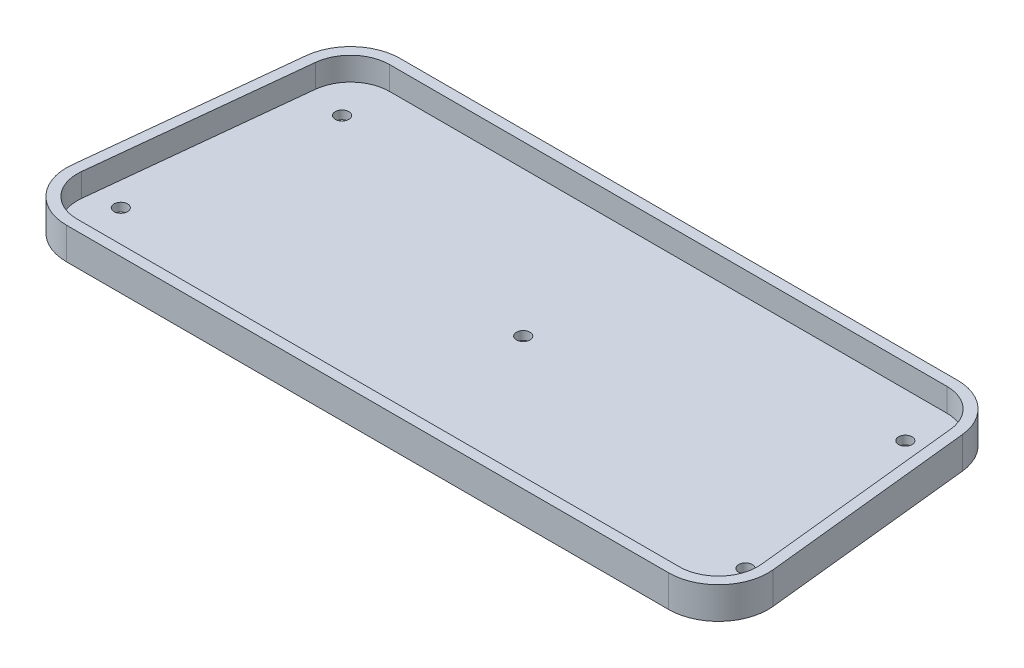
ISO-10303-21;
HEADER;
FILE_DESCRIPTION(('STEP AP214'),'2;1');
FILE_NAME('part.step','',(''),(''),'','','');
FILE_SCHEMA(('AUTOMOTIVE_DESIGN { 1 0 10303 214 1 1 1 1 }'));
ENDSEC;
DATA;
#1=APPLICATION_CONTEXT('core data for automotive mechanical design processes');
#2=APPLICATION_PROTOCOL_DEFINITION('international standard','automotive_design',2000,#1);
#3=PRODUCT_CONTEXT('',#1,'mechanical');
#4=PRODUCT('Part','Part','',(#3));
#5=PRODUCT_RELATED_PRODUCT_CATEGORY('part','',(#4));
#6=PRODUCT_DEFINITION_FORMATION('','',#4);
#7=PRODUCT_DEFINITION_CONTEXT('part definition',#1,'design');
#8=PRODUCT_DEFINITION('design','',#6,#7);
#9=PRODUCT_DEFINITION_SHAPE('','',#8);
#10=(LENGTH_UNIT() NAMED_UNIT(*) SI_UNIT(.MILLI.,.METRE.));
#11=(NAMED_UNIT(*) PLANE_ANGLE_UNIT() SI_UNIT($,.RADIAN.));
#12=(NAMED_UNIT(*) SI_UNIT($,.STERADIAN.) SOLID_ANGLE_UNIT());
#13=UNCERTAINTY_MEASURE_WITH_UNIT(LENGTH_MEASURE(1.E-05),#10,'distance_accuracy_value','');
#14=(GEOMETRIC_REPRESENTATION_CONTEXT(3) GLOBAL_UNCERTAINTY_ASSIGNED_CONTEXT((#13)) GLOBAL_UNIT_ASSIGNED_CONTEXT((#10,
#11,#12)) REPRESENTATION_CONTEXT('',''));
#15=CARTESIAN_POINT('',(0.,0.,0.));
#16=DIRECTION('',(0.,0.,1.));
#17=DIRECTION('',(1.,0.,0.));
#18=AXIS2_PLACEMENT_3D('',#15,#16,#17);
#19=CARTESIAN_POINT('',(-96.2493292957829,2.54,2.46915133417901));
#20=DIRECTION('',(0.,1.,0.));
#21=DIRECTION('',(0.,0.,1.));
#22=AXIS2_PLACEMENT_3D('',#19,#20,#21);
#23=PLANE('',#22);
#24=CARTESIAN_POINT('',(-99.6190894182931,2.54,-2.26032866582099));
#25=DIRECTION('',(0.,1.,0.));
#26=DIRECTION('',(0.,0.,1.));
#27=AXIS2_PLACEMENT_3D('',#24,#25,#26);
#28=CIRCLE('',#27,2.03200000000001);
#29=CARTESIAN_POINT('',(-99.6190894182931,2.54,-0.228328665820987));
#30=VERTEX_POINT('',#29);
#31=EDGE_CURVE('E284',#30,#30,#28,.T.);
#32=ORIENTED_EDGE('',*,*,#31,.F.);
#33=EDGE_LOOP('',(#32));
#34=FACE_BOUND('',#33,.T.);
#35=CARTESIAN_POINT('',(87.7313105817069,2.54,-2.26032866582102));
#36=DIRECTION('',(0.,1.,0.));
#37=DIRECTION('',(0.,0.,1.));
#38=AXIS2_PLACEMENT_3D('',#35,#36,#37);
#39=CIRCLE('',#38,2.03200000000001);
#40=CARTESIAN_POINT('',(87.7313105817069,2.54,-0.228328665821011));
#41=VERTEX_POINT('',#40);
#42=EDGE_CURVE('E299',#41,#41,#39,.T.);
#43=ORIENTED_EDGE('',*,*,#42,.F.);
#44=EDGE_LOOP('',(#43));
#45=FACE_BOUND('',#44,.T.);
#46=CARTESIAN_POINT('',(-96.2493292957829,2.54,2.46915133417901));
#47=DIRECTION('',(0.,1.,0.));
#48=DIRECTION('',(0.,0.,1.));
#49=AXIS2_PLACEMENT_3D('',#46,#47,#48);
#50=CIRCLE('',#49,11.7475);
#51=CARTESIAN_POINT('',(-107.931308609526,2.54,1.23015352817597));
#52=VERTEX_POINT('',#51);
#53=CARTESIAN_POINT('',(-96.2493292957829,2.54,14.216651334179));
#54=VERTEX_POINT('',#53);
#55=EDGE_CURVE('E308',#52,#54,#50,.T.);
#56=ORIENTED_EDGE('',*,*,#55,.T.);
#57=DIRECTION('',(1.,0.,0.));
#58=VECTOR('',#57,1.);
#59=CARTESIAN_POINT('',(-96.2493292957829,2.54,14.216651334179));
#60=LINE('',#59,#58);
#61=CARTESIAN_POINT('',(84.3615504591966,2.54,14.216651334179));
#62=VERTEX_POINT('',#61);
#63=EDGE_CURVE('E71',#54,#62,#60,.T.);
#64=ORIENTED_EDGE('',*,*,#63,.T.);
#65=CARTESIAN_POINT('',(84.3615504591966,2.54,2.46915133417898));
#66=DIRECTION('',(0.,1.,0.));
#67=DIRECTION('',(0.,0.,1.));
#68=AXIS2_PLACEMENT_3D('',#65,#66,#67);
#69=CIRCLE('',#68,11.7475);
#70=CARTESIAN_POINT('',(96.0435297729397,2.54,1.23015352817594));
#71=VERTEX_POINT('',#70);
#72=EDGE_CURVE('E313',#62,#71,#69,.T.);
#73=ORIENTED_EDGE('',*,*,#72,.T.);
#74=DIRECTION('',(-0.105469062013453,0.,-0.994422584698277));
#75=VECTOR('',#74,1.);
#76=CARTESIAN_POINT('',(96.0435297729397,2.54,1.23015352817595));
#77=LINE('',#76,#75);
#78=CARTESIAN_POINT('',(89.3086812880912,2.54,-62.2698464718241));
#79=VERTEX_POINT('',#78);
#80=EDGE_CURVE('E320',#71,#79,#77,.T.);
#81=ORIENTED_EDGE('',*,*,#80,.T.);
#82=CARTESIAN_POINT('',(77.6267019743482,2.54,-61.030848665821));
#83=DIRECTION('',(0.,1.,0.));
#84=DIRECTION('',(0.,0.,1.));
#85=AXIS2_PLACEMENT_3D('',#82,#83,#84);
#86=CIRCLE('',#85,11.7475);
#87=CARTESIAN_POINT('',(77.6267019743482,2.54,-72.778348665821));
#88=VERTEX_POINT('',#87);
#89=EDGE_CURVE('E318',#79,#88,#86,.T.);
#90=ORIENTED_EDGE('',*,*,#89,.T.);
#91=DIRECTION('',(-1.,0.,0.));
#92=VECTOR('',#91,1.);
#93=CARTESIAN_POINT('',(77.6267019743482,2.54,-72.778348665821));
#94=LINE('',#93,#92);
#95=CARTESIAN_POINT('',(-89.5144808109344,2.54,-72.778348665821));
#96=VERTEX_POINT('',#95);
#97=EDGE_CURVE('E324',#88,#96,#94,.T.);
#98=ORIENTED_EDGE('',*,*,#97,.T.);
#99=CARTESIAN_POINT('',(-89.5144808109345,2.54,-61.030848665821));
#100=DIRECTION('',(0.,1.,0.));
#101=DIRECTION('',(0.,0.,1.));
#102=AXIS2_PLACEMENT_3D('',#99,#100,#101);
#103=CIRCLE('',#102,11.7475);
#104=CARTESIAN_POINT('',(-101.196460124677,2.54,-62.269846471824));
#105=VERTEX_POINT('',#104);
#106=EDGE_CURVE('E57',#96,#105,#103,.T.);
#107=ORIENTED_EDGE('',*,*,#106,.T.);
#108=DIRECTION('',(-0.105469062013454,0.,0.994422584698277));
#109=VECTOR('',#108,1.);
#110=CARTESIAN_POINT('',(-101.196460124677,2.54,-62.269846471824));
#111=LINE('',#110,#109);
#112=EDGE_CURVE('E11',#105,#52,#111,.T.);
#113=ORIENTED_EDGE('',*,*,#112,.T.);
#114=EDGE_LOOP('',(#56,#64,#73,#81,#90,#98,#107,#113));
#115=FACE_BOUND('',#114,.T.);
#116=CARTESIAN_POINT('',(78.5238105817069,2.54,-59.410328665821));
#117=DIRECTION('',(0.,1.,0.));
#118=DIRECTION('',(0.,0.,1.));
#119=AXIS2_PLACEMENT_3D('',#116,#117,#118);
#120=CIRCLE('',#119,2.03200000000001);
#121=CARTESIAN_POINT('',(78.5238105817069,2.54,-57.378328665821));
#122=VERTEX_POINT('',#121);
#123=EDGE_CURVE('E304',#122,#122,#120,.T.);
#124=ORIENTED_EDGE('',*,*,#123,.F.);
#125=EDGE_LOOP('',(#124));
#126=FACE_BOUND('',#125,.T.);
#127=CARTESIAN_POINT('',(-5.94388941829314,2.54,-29.2808486658209));
#128=DIRECTION('',(0.,1.,0.));
#129=DIRECTION('',(0.,0.,1.));
#130=AXIS2_PLACEMENT_3D('',#127,#128,#129);
#131=CIRCLE('',#130,2.032);
#132=CARTESIAN_POINT('',(-5.94388941829314,2.54,-27.2488486658209));
#133=VERTEX_POINT('',#132);
#134=EDGE_CURVE('E293',#133,#133,#131,.T.);
#135=ORIENTED_EDGE('',*,*,#134,.F.);
#136=EDGE_LOOP('',(#135));
#137=FACE_BOUND('',#136,.T.);
#138=CARTESIAN_POINT('',(-90.4115894182932,2.54,-59.410328665821));
#139=DIRECTION('',(0.,1.,0.));
#140=DIRECTION('',(0.,0.,1.));
#141=AXIS2_PLACEMENT_3D('',#138,#139,#140);
#142=CIRCLE('',#141,2.03200000000001);
#143=CARTESIAN_POINT('',(-90.4115894182932,2.54,-57.378328665821));
#144=VERTEX_POINT('',#143);
#145=EDGE_CURVE('E276',#144,#144,#142,.T.);
#146=ORIENTED_EDGE('',*,*,#145,.F.);
#147=EDGE_LOOP('',(#146));
#148=FACE_BOUND('',#147,.T.);
#149=ADVANCED_FACE('F50',(#34,#45,#115,#126,#137,#148),#23,.T.);
#150=CARTESIAN_POINT('',(-96.2493292957829,0.,2.46915133417901));
#151=DIRECTION('',(0.,1.,0.));
#152=DIRECTION('',(0.,0.,1.));
#153=AXIS2_PLACEMENT_3D('',#150,#151,#152);
#154=PLANE('',#153);
#155=CARTESIAN_POINT('',(78.5238105817069,0.,-59.410328665821));
#156=DIRECTION('',(0.,1.,0.));
#157=DIRECTION('',(0.,0.,1.));
#158=AXIS2_PLACEMENT_3D('',#155,#156,#157);
#159=CIRCLE('',#158,2.03200000000001);
#160=CARTESIAN_POINT('',(78.5238105817069,0.,-57.378328665821));
#161=VERTEX_POINT('',#160);
#162=EDGE_CURVE('E305',#161,#161,#159,.T.);
#163=ORIENTED_EDGE('',*,*,#162,.T.);
#164=EDGE_LOOP('',(#163));
#165=FACE_BOUND('',#164,.T.);
#166=CARTESIAN_POINT('',(87.7313105817069,0.,-2.26032866582102));
#167=DIRECTION('',(0.,1.,0.));
#168=DIRECTION('',(0.,0.,1.));
#169=AXIS2_PLACEMENT_3D('',#166,#167,#168);
#170=CIRCLE('',#169,2.03200000000001);
#171=CARTESIAN_POINT('',(87.7313105817069,0.,-0.228328665821011));
#172=VERTEX_POINT('',#171);
#173=EDGE_CURVE('E294',#172,#172,#170,.T.);
#174=ORIENTED_EDGE('',*,*,#173,.T.);
#175=EDGE_LOOP('',(#174));
#176=FACE_BOUND('',#175,.T.);
#177=CARTESIAN_POINT('',(-5.94388941829314,0.,-29.2808486658209));
#178=DIRECTION('',(0.,1.,0.));
#179=DIRECTION('',(0.,0.,1.));
#180=AXIS2_PLACEMENT_3D('',#177,#178,#179);
#181=CIRCLE('',#180,2.032);
#182=CARTESIAN_POINT('',(-5.94388941829314,0.,-27.2488486658209));
#183=VERTEX_POINT('',#182);
#184=EDGE_CURVE('E287',#183,#183,#181,.T.);
#185=ORIENTED_EDGE('',*,*,#184,.T.);
#186=EDGE_LOOP('',(#185));
#187=FACE_BOUND('',#186,.T.);
#188=CARTESIAN_POINT('',(-99.6190894182931,0.,-2.26032866582099));
#189=DIRECTION('',(0.,1.,0.));
#190=DIRECTION('',(0.,0.,1.));
#191=AXIS2_PLACEMENT_3D('',#188,#189,#190);
#192=CIRCLE('',#191,2.03200000000001);
#193=CARTESIAN_POINT('',(-99.6190894182931,0.,-0.228328665820987));
#194=VERTEX_POINT('',#193);
#195=EDGE_CURVE('E285',#194,#194,#192,.T.);
#196=ORIENTED_EDGE('',*,*,#195,.T.);
#197=EDGE_LOOP('',(#196));
#198=FACE_BOUND('',#197,.T.);
#199=CARTESIAN_POINT('',(-90.4115894182932,0.,-59.410328665821));
#200=DIRECTION('',(0.,1.,0.));
#201=DIRECTION('',(0.,0.,1.));
#202=AXIS2_PLACEMENT_3D('',#199,#200,#201);
#203=CIRCLE('',#202,2.03200000000001);
#204=CARTESIAN_POINT('',(-90.4115894182932,0.,-57.378328665821));
#205=VERTEX_POINT('',#204);
#206=EDGE_CURVE('E250',#205,#205,#203,.T.);
#207=ORIENTED_EDGE('',*,*,#206,.T.);
#208=EDGE_LOOP('',(#207));
#209=FACE_BOUND('',#208,.T.);
#210=DIRECTION('',(-0.105469062013453,0.,-0.994422584698277));
#211=VECTOR('',#210,1.);
#212=CARTESIAN_POINT('',(98.0034403468048,0.,-10.3943042792065));
#213=LINE('',#212,#211);
#214=CARTESIAN_POINT('',(99.2008214793567,0.,0.895289256283233));
#215=VERTEX_POINT('',#214);
#216=CARTESIAN_POINT('',(92.4659729945082,0.,-62.6047107437168));
#217=VERTEX_POINT('',#216);
#218=EDGE_CURVE('E225',#215,#217,#213,.T.);
#219=ORIENTED_EDGE('',*,*,#218,.F.);
#220=CARTESIAN_POINT('',(84.3615504591966,0.,2.46915133417898));
#221=DIRECTION('',(0.,-1.,0.));
#222=DIRECTION('',(0.,0.,-1.));
#223=AXIS2_PLACEMENT_3D('',#220,#221,#222);
#224=CIRCLE('',#223,14.9225);
#225=CARTESIAN_POINT('',(84.3615504591966,0.,17.391651334179));
#226=VERTEX_POINT('',#225);
#227=EDGE_CURVE('E224',#215,#226,#224,.T.);
#228=ORIENTED_EDGE('',*,*,#227,.T.);
#229=DIRECTION('',(1.,0.,0.));
#230=VECTOR('',#229,1.);
#231=CARTESIAN_POINT('',(0.,0.,17.391651334179));
#232=LINE('',#231,#230);
#233=CARTESIAN_POINT('',(-96.2493292957829,0.,17.391651334179));
#234=VERTEX_POINT('',#233);
#235=EDGE_CURVE('E226',#234,#226,#232,.T.);
#236=ORIENTED_EDGE('',*,*,#235,.F.);
#237=CARTESIAN_POINT('',(-96.2493292957829,0.,2.46915133417901));
#238=DIRECTION('',(0.,-1.,0.));
#239=DIRECTION('',(0.,0.,-1.));
#240=AXIS2_PLACEMENT_3D('',#237,#238,#239);
#241=CIRCLE('',#240,14.9225);
#242=CARTESIAN_POINT('',(-111.088600315943,0.,0.895289256283271));
#243=VERTEX_POINT('',#242);
#244=EDGE_CURVE('E235',#234,#243,#241,.T.);
#245=ORIENTED_EDGE('',*,*,#244,.T.);
#246=DIRECTION('',(-0.105469062013454,0.,0.994422584698277));
#247=VECTOR('',#246,1.);
#248=CARTESIAN_POINT('',(-109.758982824028,0.,-11.6411042389121));
#249=LINE('',#248,#247);
#250=CARTESIAN_POINT('',(-104.353751831094,0.,-62.6047107437168));
#251=VERTEX_POINT('',#250);
#252=EDGE_CURVE('E232',#251,#243,#249,.T.);
#253=ORIENTED_EDGE('',*,*,#252,.F.);
#254=CARTESIAN_POINT('',(-89.5144808109345,0.,-61.030848665821));
#255=DIRECTION('',(0.,-1.,0.));
#256=DIRECTION('',(0.,0.,-1.));
#257=AXIS2_PLACEMENT_3D('',#254,#255,#256);
#258=CIRCLE('',#257,14.9225);
#259=CARTESIAN_POINT('',(-89.5144808109344,0.,-75.953348665821));
#260=VERTEX_POINT('',#259);
#261=EDGE_CURVE('E237',#251,#260,#258,.T.);
#262=ORIENTED_EDGE('',*,*,#261,.T.);
#263=DIRECTION('',(-1.,0.,0.));
#264=VECTOR('',#263,1.);
#265=CARTESIAN_POINT('',(0.,0.,-75.953348665821));
#266=LINE('',#265,#264);
#267=CARTESIAN_POINT('',(77.6267019743482,0.,-75.953348665821));
#268=VERTEX_POINT('',#267);
#269=EDGE_CURVE('E183',#268,#260,#266,.T.);
#270=ORIENTED_EDGE('',*,*,#269,.F.);
#271=CARTESIAN_POINT('',(77.6267019743482,0.,-61.030848665821));
#272=DIRECTION('',(0.,-1.,0.));
#273=DIRECTION('',(0.,0.,-1.));
#274=AXIS2_PLACEMENT_3D('',#271,#272,#273);
#275=CIRCLE('',#274,14.9225);
#276=EDGE_CURVE('E181',#268,#217,#275,.T.);
#277=ORIENTED_EDGE('',*,*,#276,.T.);
#278=EDGE_LOOP('',(#219,#228,#236,#245,#253,#262,#270,#277));
#279=FACE_BOUND('',#278,.T.);
#280=ADVANCED_FACE('F47',(#165,#176,#187,#198,#209,#279),#154,.F.);
#281=CARTESIAN_POINT('',(78.5238105817069,2.54,-59.410328665821));
#282=DIRECTION('',(0.,-1.,0.));
#283=DIRECTION('',(0.,0.,-1.));
#284=AXIS2_PLACEMENT_3D('',#281,#282,#283);
#285=CYLINDRICAL_SURFACE('',#284,2.03200000000001);
#286=ORIENTED_EDGE('',*,*,#123,.T.);
#287=EDGE_LOOP('',(#286));
#288=FACE_BOUND('',#287,.T.);
#289=ORIENTED_EDGE('',*,*,#162,.F.);
#290=EDGE_LOOP('',(#289));
#291=FACE_BOUND('',#290,.T.);
#292=ADVANCED_FACE('F358',(#288,#291),#285,.F.);
#293=CARTESIAN_POINT('',(87.7313105817069,2.54,-2.26032866582102));
#294=DIRECTION('',(0.,-1.,0.));
#295=DIRECTION('',(0.,0.,-1.));
#296=AXIS2_PLACEMENT_3D('',#293,#294,#295);
#297=CYLINDRICAL_SURFACE('',#296,2.03200000000001);
#298=ORIENTED_EDGE('',*,*,#42,.T.);
#299=EDGE_LOOP('',(#298));
#300=FACE_BOUND('',#299,.T.);
#301=ORIENTED_EDGE('',*,*,#173,.F.);
#302=EDGE_LOOP('',(#301));
#303=FACE_BOUND('',#302,.T.);
#304=ADVANCED_FACE('F361',(#300,#303),#297,.F.);
#305=CARTESIAN_POINT('',(-5.94388941829314,2.54,-29.2808486658209));
#306=DIRECTION('',(0.,-1.,0.));
#307=DIRECTION('',(0.,0.,-1.));
#308=AXIS2_PLACEMENT_3D('',#305,#306,#307);
#309=CYLINDRICAL_SURFACE('',#308,2.032);
#310=ORIENTED_EDGE('',*,*,#134,.T.);
#311=EDGE_LOOP('',(#310));
#312=FACE_BOUND('',#311,.T.);
#313=ORIENTED_EDGE('',*,*,#184,.F.);
#314=EDGE_LOOP('',(#313));
#315=FACE_BOUND('',#314,.T.);
#316=ADVANCED_FACE('F370',(#312,#315),#309,.F.);
#317=CARTESIAN_POINT('',(-99.6190894182931,2.54,-2.26032866582099));
#318=DIRECTION('',(0.,-1.,0.));
#319=DIRECTION('',(0.,0.,-1.));
#320=AXIS2_PLACEMENT_3D('',#317,#318,#319);
#321=CYLINDRICAL_SURFACE('',#320,2.03200000000001);
#322=ORIENTED_EDGE('',*,*,#31,.T.);
#323=EDGE_LOOP('',(#322));
#324=FACE_BOUND('',#323,.T.);
#325=ORIENTED_EDGE('',*,*,#195,.F.);
#326=EDGE_LOOP('',(#325));
#327=FACE_BOUND('',#326,.T.);
#328=ADVANCED_FACE('F371',(#324,#327),#321,.F.);
#329=CARTESIAN_POINT('',(-90.4115894182932,2.54,-59.410328665821));
#330=DIRECTION('',(0.,-1.,0.));
#331=DIRECTION('',(0.,0.,-1.));
#332=AXIS2_PLACEMENT_3D('',#329,#330,#331);
#333=CYLINDRICAL_SURFACE('',#332,2.03200000000001);
#334=ORIENTED_EDGE('',*,*,#145,.T.);
#335=EDGE_LOOP('',(#334));
#336=FACE_BOUND('',#335,.T.);
#337=ORIENTED_EDGE('',*,*,#206,.F.);
#338=EDGE_LOOP('',(#337));
#339=FACE_BOUND('',#338,.T.);
#340=ADVANCED_FACE('F374',(#336,#339),#333,.F.);
#341=CARTESIAN_POINT('',(98.0034403468048,9.525,-10.3943042792065));
#342=DIRECTION('',(-0.994422584698277,0.,0.105469062013453));
#343=DIRECTION('',(0.105469062013453,0.,0.994422584698277));
#344=AXIS2_PLACEMENT_3D('',#341,#342,#343);
#345=PLANE('',#344);
#346=ORIENTED_EDGE('',*,*,#218,.T.);
#347=DIRECTION('',(0.,-1.,0.));
#348=VECTOR('',#347,1.);
#349=CARTESIAN_POINT('',(92.4659729945082,9.525,-62.6047107437168));
#350=LINE('',#349,#348);
#351=CARTESIAN_POINT('',(92.4659729945082,9.525,-62.6047107437168));
#352=VERTEX_POINT('',#351);
#353=EDGE_CURVE('E244',#352,#217,#350,.T.);
#354=ORIENTED_EDGE('',*,*,#353,.F.);
#355=DIRECTION('',(-0.105469062013453,0.,-0.994422584698277));
#356=VECTOR('',#355,1.);
#357=CARTESIAN_POINT('',(98.0034403468048,9.525,-10.3943042792065));
#358=LINE('',#357,#356);
#359=CARTESIAN_POINT('',(99.2008214793567,9.525,0.895289256283233));
#360=VERTEX_POINT('',#359);
#361=EDGE_CURVE('E199',#360,#352,#358,.T.);
#362=ORIENTED_EDGE('',*,*,#361,.F.);
#363=DIRECTION('',(0.,-1.,0.));
#364=VECTOR('',#363,1.);
#365=CARTESIAN_POINT('',(99.2008214793567,9.525,0.895289256283233));
#366=LINE('',#365,#364);
#367=EDGE_CURVE('E258',#360,#215,#366,.T.);
#368=ORIENTED_EDGE('',*,*,#367,.T.);
#369=EDGE_LOOP('',(#346,#354,#362,#368));
#370=FACE_BOUND('',#369,.T.);
#371=ADVANCED_FACE('F377',(#370),#345,.F.);
#372=CARTESIAN_POINT('',(77.6267019743482,9.525,-61.030848665821));
#373=DIRECTION('',(0.,-1.,0.));
#374=DIRECTION('',(0.,0.,-1.));
#375=AXIS2_PLACEMENT_3D('',#372,#373,#374);
#376=CYLINDRICAL_SURFACE('',#375,14.9225);
#377=ORIENTED_EDGE('',*,*,#276,.F.);
#378=DIRECTION('',(0.,-1.,0.));
#379=VECTOR('',#378,1.);
#380=CARTESIAN_POINT('',(77.6267019743482,9.525,-75.953348665821));
#381=LINE('',#380,#379);
#382=CARTESIAN_POINT('',(77.6267019743482,9.525,-75.953348665821));
#383=VERTEX_POINT('',#382);
#384=EDGE_CURVE('E247',#383,#268,#381,.T.);
#385=ORIENTED_EDGE('',*,*,#384,.F.);
#386=CARTESIAN_POINT('',(77.6267019743482,9.525,-61.030848665821));
#387=DIRECTION('',(0.,-1.,0.));
#388=DIRECTION('',(0.,0.,-1.));
#389=AXIS2_PLACEMENT_3D('',#386,#387,#388);
#390=CIRCLE('',#389,14.9225);
#391=EDGE_CURVE('E178',#383,#352,#390,.T.);
#392=ORIENTED_EDGE('',*,*,#391,.T.);
#393=ORIENTED_EDGE('',*,*,#353,.T.);
#394=EDGE_LOOP('',(#377,#385,#392,#393));
#395=FACE_BOUND('',#394,.T.);
#396=ADVANCED_FACE('F401',(#395),#376,.T.);
#397=CARTESIAN_POINT('',(0.,9.525,-75.953348665821));
#398=DIRECTION('',(0.,0.,1.));
#399=DIRECTION('',(1.,0.,0.));
#400=AXIS2_PLACEMENT_3D('',#397,#398,#399);
#401=PLANE('',#400);
#402=ORIENTED_EDGE('',*,*,#269,.T.);
#403=DIRECTION('',(0.,-1.,0.));
#404=VECTOR('',#403,1.);
#405=CARTESIAN_POINT('',(-89.5144808109344,9.525,-75.953348665821));
#406=LINE('',#405,#404);
#407=CARTESIAN_POINT('',(-89.5144808109344,9.525,-75.953348665821));
#408=VERTEX_POINT('',#407);
#409=EDGE_CURVE('E249',#408,#260,#406,.T.);
#410=ORIENTED_EDGE('',*,*,#409,.F.);
#411=DIRECTION('',(-1.,0.,0.));
#412=VECTOR('',#411,1.);
#413=CARTESIAN_POINT('',(0.,9.525,-75.953348665821));
#414=LINE('',#413,#412);
#415=EDGE_CURVE('E220',#383,#408,#414,.T.);
#416=ORIENTED_EDGE('',*,*,#415,.F.);
#417=ORIENTED_EDGE('',*,*,#384,.T.);
#418=EDGE_LOOP('',(#402,#410,#416,#417));
#419=FACE_BOUND('',#418,.T.);
#420=ADVANCED_FACE('F399',(#419),#401,.F.);
#421=CARTESIAN_POINT('',(-89.5144808109345,9.525,-61.030848665821));
#422=DIRECTION('',(0.,-1.,0.));
#423=DIRECTION('',(0.,0.,-1.));
#424=AXIS2_PLACEMENT_3D('',#421,#422,#423);
#425=CYLINDRICAL_SURFACE('',#424,14.9225);
#426=ORIENTED_EDGE('',*,*,#261,.F.);
#427=DIRECTION('',(0.,-1.,0.));
#428=VECTOR('',#427,1.);
#429=CARTESIAN_POINT('',(-104.353751831094,9.525,-62.6047107437168));
#430=LINE('',#429,#428);
#431=CARTESIAN_POINT('',(-104.353751831094,9.525,-62.6047107437168));
#432=VERTEX_POINT('',#431);
#433=EDGE_CURVE('E255',#432,#251,#430,.T.);
#434=ORIENTED_EDGE('',*,*,#433,.F.);
#435=CARTESIAN_POINT('',(-89.5144808109345,9.525,-61.030848665821));
#436=DIRECTION('',(0.,-1.,0.));
#437=DIRECTION('',(0.,0.,-1.));
#438=AXIS2_PLACEMENT_3D('',#435,#436,#437);
#439=CIRCLE('',#438,14.9225);
#440=EDGE_CURVE('E211',#432,#408,#439,.T.);
#441=ORIENTED_EDGE('',*,*,#440,.T.);
#442=ORIENTED_EDGE('',*,*,#409,.T.);
#443=EDGE_LOOP('',(#426,#434,#441,#442));
#444=FACE_BOUND('',#443,.T.);
#445=ADVANCED_FACE('F405',(#444),#425,.T.);
#446=CARTESIAN_POINT('',(-109.758982824028,9.525,-11.6411042389121));
#447=DIRECTION('',(0.994422584698277,0.,0.105469062013454));
#448=DIRECTION('',(0.105469062013454,0.,-0.994422584698277));
#449=AXIS2_PLACEMENT_3D('',#446,#447,#448);
#450=PLANE('',#449);
#451=ORIENTED_EDGE('',*,*,#252,.T.);
#452=DIRECTION('',(0.,-1.,0.));
#453=VECTOR('',#452,1.);
#454=CARTESIAN_POINT('',(-111.088600315943,9.525,0.895289256283271));
#455=LINE('',#454,#453);
#456=CARTESIAN_POINT('',(-111.088600315943,9.525,0.895289256283271));
#457=VERTEX_POINT('',#456);
#458=EDGE_CURVE('E251',#457,#243,#455,.T.);
#459=ORIENTED_EDGE('',*,*,#458,.F.);
#460=DIRECTION('',(-0.105469062013454,0.,0.994422584698277));
#461=VECTOR('',#460,1.);
#462=CARTESIAN_POINT('',(-109.758982824028,9.525,-11.6411042389121));
#463=LINE('',#462,#461);
#464=EDGE_CURVE('E212',#432,#457,#463,.T.);
#465=ORIENTED_EDGE('',*,*,#464,.F.);
#466=ORIENTED_EDGE('',*,*,#433,.T.);
#467=EDGE_LOOP('',(#451,#459,#465,#466));
#468=FACE_BOUND('',#467,.T.);
#469=ADVANCED_FACE('F442',(#468),#450,.F.);
#470=CARTESIAN_POINT('',(-96.2493292957829,9.525,2.46915133417901));
#471=DIRECTION('',(0.,-1.,0.));
#472=DIRECTION('',(0.,0.,-1.));
#473=AXIS2_PLACEMENT_3D('',#470,#471,#472);
#474=CYLINDRICAL_SURFACE('',#473,14.9225);
#475=ORIENTED_EDGE('',*,*,#244,.F.);
#476=DIRECTION('',(0.,-1.,0.));
#477=VECTOR('',#476,1.);
#478=CARTESIAN_POINT('',(-96.2493292957829,9.525,17.391651334179));
#479=LINE('',#478,#477);
#480=CARTESIAN_POINT('',(-96.2493292957829,9.525,17.391651334179));
#481=VERTEX_POINT('',#480);
#482=EDGE_CURVE('E257',#481,#234,#479,.T.);
#483=ORIENTED_EDGE('',*,*,#482,.F.);
#484=CARTESIAN_POINT('',(-96.2493292957829,9.525,2.46915133417901));
#485=DIRECTION('',(0.,-1.,0.));
#486=DIRECTION('',(0.,0.,-1.));
#487=AXIS2_PLACEMENT_3D('',#484,#485,#486);
#488=CIRCLE('',#487,14.9225);
#489=EDGE_CURVE('E206',#481,#457,#488,.T.);
#490=ORIENTED_EDGE('',*,*,#489,.T.);
#491=ORIENTED_EDGE('',*,*,#458,.T.);
#492=EDGE_LOOP('',(#475,#483,#490,#491));
#493=FACE_BOUND('',#492,.T.);
#494=ADVANCED_FACE('F454',(#493),#474,.T.);
#495=CARTESIAN_POINT('',(0.,9.525,17.391651334179));
#496=DIRECTION('',(0.,0.,-1.));
#497=DIRECTION('',(-1.,0.,0.));
#498=AXIS2_PLACEMENT_3D('',#495,#496,#497);
#499=PLANE('',#498);
#500=ORIENTED_EDGE('',*,*,#235,.T.);
#501=DIRECTION('',(0.,-1.,0.));
#502=VECTOR('',#501,1.);
#503=CARTESIAN_POINT('',(84.3615504591966,9.525,17.391651334179));
#504=LINE('',#503,#502);
#505=CARTESIAN_POINT('',(84.3615504591966,9.525,17.391651334179));
#506=VERTEX_POINT('',#505);
#507=EDGE_CURVE('E259',#506,#226,#504,.T.);
#508=ORIENTED_EDGE('',*,*,#507,.F.);
#509=DIRECTION('',(1.,0.,0.));
#510=VECTOR('',#509,1.);
#511=CARTESIAN_POINT('',(0.,9.525,17.391651334179));
#512=LINE('',#511,#510);
#513=EDGE_CURVE('E204',#481,#506,#512,.T.);
#514=ORIENTED_EDGE('',*,*,#513,.F.);
#515=ORIENTED_EDGE('',*,*,#482,.T.);
#516=EDGE_LOOP('',(#500,#508,#514,#515));
#517=FACE_BOUND('',#516,.T.);
#518=ADVANCED_FACE('F347',(#517),#499,.F.);
#519=CARTESIAN_POINT('',(-96.2493292957829,9.525,2.46915133417901));
#520=DIRECTION('',(0.,-1.,0.));
#521=DIRECTION('',(0.,0.,-1.));
#522=AXIS2_PLACEMENT_3D('',#519,#520,#521);
#523=CYLINDRICAL_SURFACE('',#522,11.7475);
#524=ORIENTED_EDGE('',*,*,#55,.F.);
#525=DIRECTION('',(0.,-1.,0.));
#526=VECTOR('',#525,1.);
#527=CARTESIAN_POINT('',(-107.931308609526,9.525,1.23015352817596));
#528=LINE('',#527,#526);
#529=CARTESIAN_POINT('',(-107.931308609526,9.525,1.23015352817596));
#530=VERTEX_POINT('',#529);
#531=EDGE_CURVE('E64',#530,#52,#528,.T.);
#532=ORIENTED_EDGE('',*,*,#531,.F.);
#533=CARTESIAN_POINT('',(-96.2493292957829,9.525,2.46915133417901));
#534=DIRECTION('',(0.,-1.,0.));
#535=DIRECTION('',(0.,0.,-1.));
#536=AXIS2_PLACEMENT_3D('',#533,#534,#535);
#537=CIRCLE('',#536,11.7475);
#538=CARTESIAN_POINT('',(-96.2493292957829,9.525,14.216651334179));
#539=VERTEX_POINT('',#538);
#540=EDGE_CURVE('E170',#539,#530,#537,.T.);
#541=ORIENTED_EDGE('',*,*,#540,.F.);
#542=DIRECTION('',(0.,-1.,0.));
#543=VECTOR('',#542,1.);
#544=CARTESIAN_POINT('',(-96.2493292957829,9.525,14.216651334179));
#545=LINE('',#544,#543);
#546=EDGE_CURVE('E173',#539,#54,#545,.T.);
#547=ORIENTED_EDGE('',*,*,#546,.T.);
#548=EDGE_LOOP('',(#524,#532,#541,#547));
#549=FACE_BOUND('',#548,.T.);
#550=ADVANCED_FACE('F179',(#549),#523,.F.);
#551=CARTESIAN_POINT('',(-106.601691117611,9.525,-11.3062399670194));
#552=DIRECTION('',(-0.994422584698277,0.,-0.105469062013454));
#553=DIRECTION('',(-0.105469062013454,0.,0.994422584698277));
#554=AXIS2_PLACEMENT_3D('',#551,#552,#553);
#555=PLANE('',#554);
#556=ORIENTED_EDGE('',*,*,#112,.F.);
#557=DIRECTION('',(0.,-1.,0.));
#558=VECTOR('',#557,1.);
#559=CARTESIAN_POINT('',(-101.196460124677,9.525,-62.269846471824));
#560=LINE('',#559,#558);
#561=CARTESIAN_POINT('',(-101.196460124677,9.525,-62.269846471824));
#562=VERTEX_POINT('',#561);
#563=EDGE_CURVE('E263',#562,#105,#560,.T.);
#564=ORIENTED_EDGE('',*,*,#563,.F.);
#565=DIRECTION('',(0.105469062013454,0.,-0.994422584698277));
#566=VECTOR('',#565,1.);
#567=CARTESIAN_POINT('',(-106.601691117611,9.525,-11.3062399670194));
#568=LINE('',#567,#566);
#569=EDGE_CURVE('E200',#530,#562,#568,.T.);
#570=ORIENTED_EDGE('',*,*,#569,.F.);
#571=ORIENTED_EDGE('',*,*,#531,.T.);
#572=EDGE_LOOP('',(#556,#564,#570,#571));
#573=FACE_BOUND('',#572,.T.);
#574=ADVANCED_FACE('F338',(#573),#555,.F.);
#575=CARTESIAN_POINT('',(-89.5144808109345,9.525,-61.030848665821));
#576=DIRECTION('',(0.,-1.,0.));
#577=DIRECTION('',(0.,0.,-1.));
#578=AXIS2_PLACEMENT_3D('',#575,#576,#577);
#579=CYLINDRICAL_SURFACE('',#578,11.7475);
#580=ORIENTED_EDGE('',*,*,#106,.F.);
#581=DIRECTION('',(0.,-1.,0.));
#582=VECTOR('',#581,1.);
#583=CARTESIAN_POINT('',(-89.5144808109344,9.525,-72.778348665821));
#584=LINE('',#583,#582);
#585=CARTESIAN_POINT('',(-89.5144808109344,9.525,-72.778348665821));
#586=VERTEX_POINT('',#585);
#587=EDGE_CURVE('E266',#586,#96,#584,.T.);
#588=ORIENTED_EDGE('',*,*,#587,.F.);
#589=CARTESIAN_POINT('',(-89.5144808109345,9.525,-61.030848665821));
#590=DIRECTION('',(0.,-1.,0.));
#591=DIRECTION('',(0.,0.,-1.));
#592=AXIS2_PLACEMENT_3D('',#589,#590,#591);
#593=CIRCLE('',#592,11.7475);
#594=EDGE_CURVE('E193',#562,#586,#593,.T.);
#595=ORIENTED_EDGE('',*,*,#594,.F.);
#596=ORIENTED_EDGE('',*,*,#563,.T.);
#597=EDGE_LOOP('',(#580,#588,#595,#596));
#598=FACE_BOUND('',#597,.T.);
#599=ADVANCED_FACE('F331',(#598),#579,.F.);
#600=CARTESIAN_POINT('',(0.,9.525,-72.778348665821));
#601=DIRECTION('',(0.,0.,-1.));
#602=DIRECTION('',(-1.,0.,0.));
#603=AXIS2_PLACEMENT_3D('',#600,#601,#602);
#604=PLANE('',#603);
#605=ORIENTED_EDGE('',*,*,#97,.F.);
#606=DIRECTION('',(0.,-1.,0.));
#607=VECTOR('',#606,1.);
#608=CARTESIAN_POINT('',(77.6267019743482,9.525,-72.778348665821));
#609=LINE('',#608,#607);
#610=CARTESIAN_POINT('',(77.6267019743482,9.525,-72.778348665821));
#611=VERTEX_POINT('',#610);
#612=EDGE_CURVE('E268',#611,#88,#609,.T.);
#613=ORIENTED_EDGE('',*,*,#612,.F.);
#614=DIRECTION('',(1.,0.,0.));
#615=VECTOR('',#614,1.);
#616=CARTESIAN_POINT('',(0.,9.525,-72.778348665821));
#617=LINE('',#616,#615);
#618=EDGE_CURVE('E195',#586,#611,#617,.T.);
#619=ORIENTED_EDGE('',*,*,#618,.F.);
#620=ORIENTED_EDGE('',*,*,#587,.T.);
#621=EDGE_LOOP('',(#605,#613,#619,#620));
#622=FACE_BOUND('',#621,.T.);
#623=ADVANCED_FACE('F337',(#622),#604,.F.);
#624=CARTESIAN_POINT('',(77.6267019743482,9.525,-61.030848665821));
#625=DIRECTION('',(0.,-1.,0.));
#626=DIRECTION('',(0.,0.,-1.));
#627=AXIS2_PLACEMENT_3D('',#624,#625,#626);
#628=CYLINDRICAL_SURFACE('',#627,11.7475);
#629=ORIENTED_EDGE('',*,*,#89,.F.);
#630=DIRECTION('',(0.,-1.,0.));
#631=VECTOR('',#630,1.);
#632=CARTESIAN_POINT('',(89.3086812880912,9.525,-62.2698464718241));
#633=LINE('',#632,#631);
#634=CARTESIAN_POINT('',(89.3086812880912,9.525,-62.2698464718241));
#635=VERTEX_POINT('',#634);
#636=EDGE_CURVE('E275',#635,#79,#633,.T.);
#637=ORIENTED_EDGE('',*,*,#636,.F.);
#638=CARTESIAN_POINT('',(77.6267019743482,9.525,-61.030848665821));
#639=DIRECTION('',(0.,-1.,0.));
#640=DIRECTION('',(0.,0.,-1.));
#641=AXIS2_PLACEMENT_3D('',#638,#639,#640);
#642=CIRCLE('',#641,11.7475);
#643=EDGE_CURVE('E188',#611,#635,#642,.T.);
#644=ORIENTED_EDGE('',*,*,#643,.F.);
#645=ORIENTED_EDGE('',*,*,#612,.T.);
#646=EDGE_LOOP('',(#629,#637,#644,#645));
#647=FACE_BOUND('',#646,.T.);
#648=ADVANCED_FACE('F391',(#647),#628,.F.);
#649=CARTESIAN_POINT('',(94.8461486403877,9.525,-10.0594400073138));
#650=DIRECTION('',(0.994422584698277,0.,-0.105469062013453));
#651=DIRECTION('',(-0.105469062013453,0.,-0.994422584698277));
#652=AXIS2_PLACEMENT_3D('',#649,#650,#651);
#653=PLANE('',#652);
#654=ORIENTED_EDGE('',*,*,#80,.F.);
#655=DIRECTION('',(0.,-1.,0.));
#656=VECTOR('',#655,1.);
#657=CARTESIAN_POINT('',(96.0435297729397,9.525,1.23015352817594));
#658=LINE('',#657,#656);
#659=CARTESIAN_POINT('',(96.0435297729397,9.525,1.23015352817594));
#660=VERTEX_POINT('',#659);
#661=EDGE_CURVE('E273',#660,#71,#658,.T.);
#662=ORIENTED_EDGE('',*,*,#661,.F.);
#663=DIRECTION('',(0.105469062013453,0.,0.994422584698277));
#664=VECTOR('',#663,1.);
#665=CARTESIAN_POINT('',(94.8461486403877,9.525,-10.0594400073138));
#666=LINE('',#665,#664);
#667=EDGE_CURVE('E189',#635,#660,#666,.T.);
#668=ORIENTED_EDGE('',*,*,#667,.F.);
#669=ORIENTED_EDGE('',*,*,#636,.T.);
#670=EDGE_LOOP('',(#654,#662,#668,#669));
#671=FACE_BOUND('',#670,.T.);
#672=ADVANCED_FACE('F390',(#671),#653,.F.);
#673=CARTESIAN_POINT('',(84.3615504591966,9.525,2.46915133417898));
#674=DIRECTION('',(0.,-1.,0.));
#675=DIRECTION('',(0.,0.,-1.));
#676=AXIS2_PLACEMENT_3D('',#673,#674,#675);
#677=CYLINDRICAL_SURFACE('',#676,11.7475);
#678=ORIENTED_EDGE('',*,*,#72,.F.);
#679=DIRECTION('',(0.,-1.,0.));
#680=VECTOR('',#679,1.);
#681=CARTESIAN_POINT('',(84.3615504591966,9.525,14.216651334179));
#682=LINE('',#681,#680);
#683=CARTESIAN_POINT('',(84.3615504591966,9.525,14.216651334179));
#684=VERTEX_POINT('',#683);
#685=EDGE_CURVE('E180',#684,#62,#682,.T.);
#686=ORIENTED_EDGE('',*,*,#685,.F.);
#687=CARTESIAN_POINT('',(84.3615504591966,9.525,2.46915133417898));
#688=DIRECTION('',(0.,-1.,0.));
#689=DIRECTION('',(0.,0.,-1.));
#690=AXIS2_PLACEMENT_3D('',#687,#688,#689);
#691=CIRCLE('',#690,11.7475);
#692=EDGE_CURVE('E169',#660,#684,#691,.T.);
#693=ORIENTED_EDGE('',*,*,#692,.F.);
#694=ORIENTED_EDGE('',*,*,#661,.T.);
#695=EDGE_LOOP('',(#678,#686,#693,#694));
#696=FACE_BOUND('',#695,.T.);
#697=ADVANCED_FACE('F381',(#696),#677,.F.);
#698=CARTESIAN_POINT('',(0.,9.525,14.216651334179));
#699=DIRECTION('',(0.,0.,1.));
#700=DIRECTION('',(1.,0.,0.));
#701=AXIS2_PLACEMENT_3D('',#698,#699,#700);
#702=PLANE('',#701);
#703=ORIENTED_EDGE('',*,*,#63,.F.);
#704=ORIENTED_EDGE('',*,*,#546,.F.);
#705=DIRECTION('',(-1.,0.,0.));
#706=VECTOR('',#705,1.);
#707=CARTESIAN_POINT('',(0.,9.525,14.216651334179));
#708=LINE('',#707,#706);
#709=EDGE_CURVE('E161',#684,#539,#708,.T.);
#710=ORIENTED_EDGE('',*,*,#709,.F.);
#711=ORIENTED_EDGE('',*,*,#685,.T.);
#712=EDGE_LOOP('',(#703,#704,#710,#711));
#713=FACE_BOUND('',#712,.T.);
#714=ADVANCED_FACE('F172',(#713),#702,.F.);
#715=CARTESIAN_POINT('',(84.3615504591966,9.525,2.46915133417898));
#716=DIRECTION('',(0.,-1.,0.));
#717=DIRECTION('',(0.,0.,-1.));
#718=AXIS2_PLACEMENT_3D('',#715,#716,#717);
#719=CYLINDRICAL_SURFACE('',#718,14.9225);
#720=ORIENTED_EDGE('',*,*,#227,.F.);
#721=ORIENTED_EDGE('',*,*,#367,.F.);
#722=CARTESIAN_POINT('',(84.3615504591966,9.525,2.46915133417898));
#723=DIRECTION('',(0.,-1.,0.));
#724=DIRECTION('',(0.,0.,-1.));
#725=AXIS2_PLACEMENT_3D('',#722,#723,#724);
#726=CIRCLE('',#725,14.9225);
#727=EDGE_CURVE('E205',#360,#506,#726,.T.);
#728=ORIENTED_EDGE('',*,*,#727,.T.);
#729=ORIENTED_EDGE('',*,*,#507,.T.);
#730=EDGE_LOOP('',(#720,#721,#728,#729));
#731=FACE_BOUND('',#730,.T.);
#732=ADVANCED_FACE('F384',(#731),#719,.T.);
#733=CARTESIAN_POINT('',(0.,9.525,0.));
#734=DIRECTION('',(0.,-1.,0.));
#735=DIRECTION('',(0.,0.,-1.));
#736=AXIS2_PLACEMENT_3D('',#733,#734,#735);
#737=PLANE('',#736);
#738=ORIENTED_EDGE('',*,*,#540,.T.);
#739=ORIENTED_EDGE('',*,*,#569,.T.);
#740=ORIENTED_EDGE('',*,*,#594,.T.);
#741=ORIENTED_EDGE('',*,*,#618,.T.);
#742=ORIENTED_EDGE('',*,*,#643,.T.);
#743=ORIENTED_EDGE('',*,*,#667,.T.);
#744=ORIENTED_EDGE('',*,*,#692,.T.);
#745=ORIENTED_EDGE('',*,*,#709,.T.);
#746=EDGE_LOOP('',(#738,#739,#740,#741,#742,#743,#744,#745));
#747=FACE_BOUND('',#746,.T.);
#748=ORIENTED_EDGE('',*,*,#361,.T.);
#749=ORIENTED_EDGE('',*,*,#391,.F.);
#750=ORIENTED_EDGE('',*,*,#415,.T.);
#751=ORIENTED_EDGE('',*,*,#440,.F.);
#752=ORIENTED_EDGE('',*,*,#464,.T.);
#753=ORIENTED_EDGE('',*,*,#489,.F.);
#754=ORIENTED_EDGE('',*,*,#513,.T.);
#755=ORIENTED_EDGE('',*,*,#727,.F.);
#756=EDGE_LOOP('',(#748,#749,#750,#751,#752,#753,#754,#755));
#757=FACE_BOUND('',#756,.T.);
#758=ADVANCED_FACE('F165',(#747,#757),#737,.F.);
#759=CLOSED_SHELL('',(#149,#280,#292,#304,#316,#328,#340,#371,#396,#420,#445,#469,#494,#518,
#550,#574,#599,#623,#648,#672,#697,#714,#732,#758));
#760=MANIFOLD_SOLID_BREP('B2',#759);
#761=ADVANCED_BREP_SHAPE_REPRESENTATION('',(#18,#760),#14);
#762=SHAPE_DEFINITION_REPRESENTATION(#9,#761);
ENDSEC;
END-ISO-10303-21;
